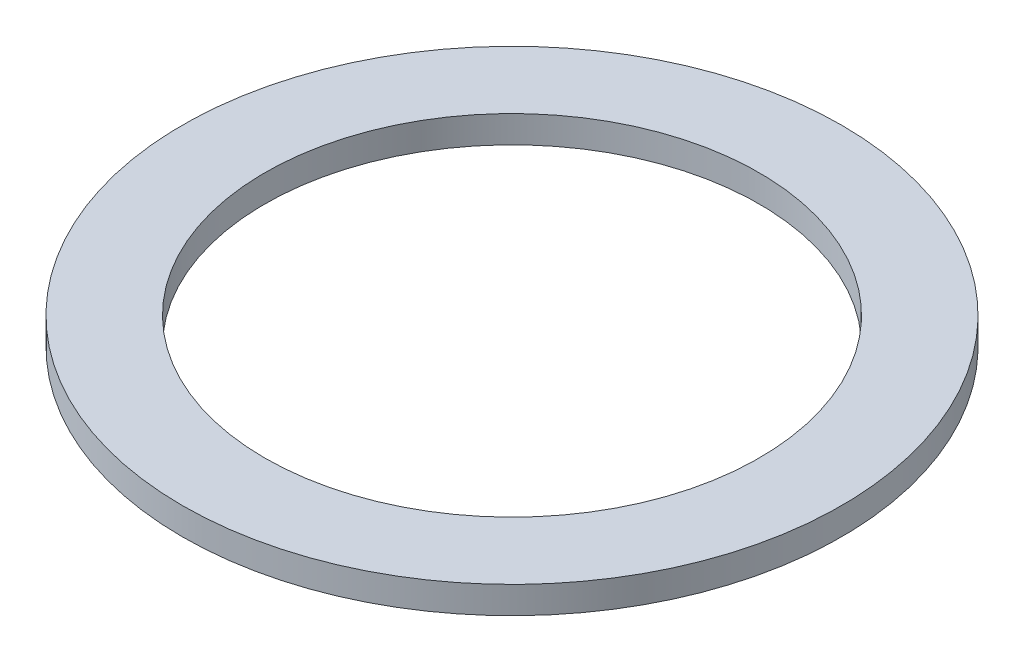
ISO-10303-21;
HEADER;
FILE_DESCRIPTION(('STEP AP214'),'2;1');
FILE_NAME('part.step','',(''),(''),'','','');
FILE_SCHEMA(('AUTOMOTIVE_DESIGN { 1 0 10303 214 1 1 1 1 }'));
ENDSEC;
DATA;
#1=APPLICATION_CONTEXT('core data for automotive mechanical design processes');
#2=APPLICATION_PROTOCOL_DEFINITION('international standard','automotive_design',2000,#1);
#3=PRODUCT_CONTEXT('',#1,'mechanical');
#4=PRODUCT('Part','Part','',(#3));
#5=PRODUCT_RELATED_PRODUCT_CATEGORY('part','',(#4));
#6=PRODUCT_DEFINITION_FORMATION('','',#4);
#7=PRODUCT_DEFINITION_CONTEXT('part definition',#1,'design');
#8=PRODUCT_DEFINITION('design','',#6,#7);
#9=PRODUCT_DEFINITION_SHAPE('','',#8);
#10=(LENGTH_UNIT() NAMED_UNIT(*) SI_UNIT(.MILLI.,.METRE.));
#11=(NAMED_UNIT(*) PLANE_ANGLE_UNIT() SI_UNIT($,.RADIAN.));
#12=(NAMED_UNIT(*) SI_UNIT($,.STERADIAN.) SOLID_ANGLE_UNIT());
#13=UNCERTAINTY_MEASURE_WITH_UNIT(LENGTH_MEASURE(1.E-05),#10,'distance_accuracy_value','');
#14=(GEOMETRIC_REPRESENTATION_CONTEXT(3) GLOBAL_UNCERTAINTY_ASSIGNED_CONTEXT((#13)) GLOBAL_UNIT_ASSIGNED_CONTEXT((#10,
#11,#12)) REPRESENTATION_CONTEXT('',''));
#15=CARTESIAN_POINT('',(0.,0.,0.));
#16=DIRECTION('',(0.,0.,1.));
#17=DIRECTION('',(1.,0.,0.));
#18=AXIS2_PLACEMENT_3D('',#15,#16,#17);
#19=CARTESIAN_POINT('',(0.,0.79375,0.));
#20=DIRECTION('',(0.,1.,0.));
#21=DIRECTION('',(0.,0.,1.));
#22=AXIS2_PLACEMENT_3D('',#19,#20,#21);
#23=PLANE('',#22);
#24=CARTESIAN_POINT('',(0.,0.79375,0.));
#25=DIRECTION('',(0.,1.,0.));
#26=DIRECTION('',(0.,0.,1.));
#27=AXIS2_PLACEMENT_3D('',#24,#25,#26);
#28=CIRCLE('',#27,19.304);
#29=CARTESIAN_POINT('',(0.,0.79375,19.304));
#30=VERTEX_POINT('',#29);
#31=EDGE_CURVE('E10',#30,#30,#28,.T.);
#32=ORIENTED_EDGE('',*,*,#31,.T.);
#33=EDGE_LOOP('',(#32));
#34=FACE_BOUND('',#33,.T.);
#35=CARTESIAN_POINT('',(0.,0.79375,0.));
#36=DIRECTION('',(0.,1.,0.));
#37=DIRECTION('',(0.,0.,1.));
#38=AXIS2_PLACEMENT_3D('',#35,#36,#37);
#39=CIRCLE('',#38,14.478);
#40=CARTESIAN_POINT('',(0.,0.79375,14.478));
#41=VERTEX_POINT('',#40);
#42=EDGE_CURVE('E50',#41,#41,#39,.T.);
#43=ORIENTED_EDGE('',*,*,#42,.F.);
#44=EDGE_LOOP('',(#43));
#45=FACE_BOUND('',#44,.T.);
#46=ADVANCED_FACE('F37',(#34,#45),#23,.T.);
#47=CARTESIAN_POINT('',(0.,-0.79375,0.));
#48=DIRECTION('',(0.,1.,0.));
#49=DIRECTION('',(0.,0.,1.));
#50=AXIS2_PLACEMENT_3D('',#47,#48,#49);
#51=PLANE('',#50);
#52=CARTESIAN_POINT('',(0.,-0.79375,0.));
#53=DIRECTION('',(0.,1.,0.));
#54=DIRECTION('',(0.,0.,1.));
#55=AXIS2_PLACEMENT_3D('',#52,#53,#54);
#56=CIRCLE('',#55,19.304);
#57=CARTESIAN_POINT('',(0.,-0.79375,19.304));
#58=VERTEX_POINT('',#57);
#59=EDGE_CURVE('E41',#58,#58,#56,.T.);
#60=ORIENTED_EDGE('',*,*,#59,.F.);
#61=EDGE_LOOP('',(#60));
#62=FACE_BOUND('',#61,.T.);
#63=CARTESIAN_POINT('',(0.,-0.79375,0.));
#64=DIRECTION('',(0.,1.,0.));
#65=DIRECTION('',(0.,0.,1.));
#66=AXIS2_PLACEMENT_3D('',#63,#64,#65);
#67=CIRCLE('',#66,14.478);
#68=CARTESIAN_POINT('',(0.,-0.79375,14.478));
#69=VERTEX_POINT('',#68);
#70=EDGE_CURVE('E52',#69,#69,#67,.T.);
#71=ORIENTED_EDGE('',*,*,#70,.T.);
#72=EDGE_LOOP('',(#71));
#73=FACE_BOUND('',#72,.T.);
#74=ADVANCED_FACE('F64',(#62,#73),#51,.F.);
#75=CARTESIAN_POINT('',(0.,0.79375,0.));
#76=DIRECTION('',(0.,-1.,0.));
#77=DIRECTION('',(0.,0.,-1.));
#78=AXIS2_PLACEMENT_3D('',#75,#76,#77);
#79=CYLINDRICAL_SURFACE('',#78,19.304);
#80=ORIENTED_EDGE('',*,*,#31,.F.);
#81=EDGE_LOOP('',(#80));
#82=FACE_BOUND('',#81,.T.);
#83=ORIENTED_EDGE('',*,*,#59,.T.);
#84=EDGE_LOOP('',(#83));
#85=FACE_BOUND('',#84,.T.);
#86=ADVANCED_FACE('F39',(#82,#85),#79,.T.);
#87=CARTESIAN_POINT('',(0.,0.79375,0.));
#88=DIRECTION('',(0.,-1.,0.));
#89=DIRECTION('',(0.,0.,-1.));
#90=AXIS2_PLACEMENT_3D('',#87,#88,#89);
#91=CYLINDRICAL_SURFACE('',#90,14.478);
#92=ORIENTED_EDGE('',*,*,#42,.T.);
#93=EDGE_LOOP('',(#92));
#94=FACE_BOUND('',#93,.T.);
#95=ORIENTED_EDGE('',*,*,#70,.F.);
#96=EDGE_LOOP('',(#95));
#97=FACE_BOUND('',#96,.T.);
#98=ADVANCED_FACE('F60',(#94,#97),#91,.F.);
#99=CLOSED_SHELL('',(#46,#74,#86,#98));
#100=MANIFOLD_SOLID_BREP('B2',#99);
#101=ADVANCED_BREP_SHAPE_REPRESENTATION('',(#18,#100),#14);
#102=SHAPE_DEFINITION_REPRESENTATION(#9,#101);
ENDSEC;
END-ISO-10303-21;
